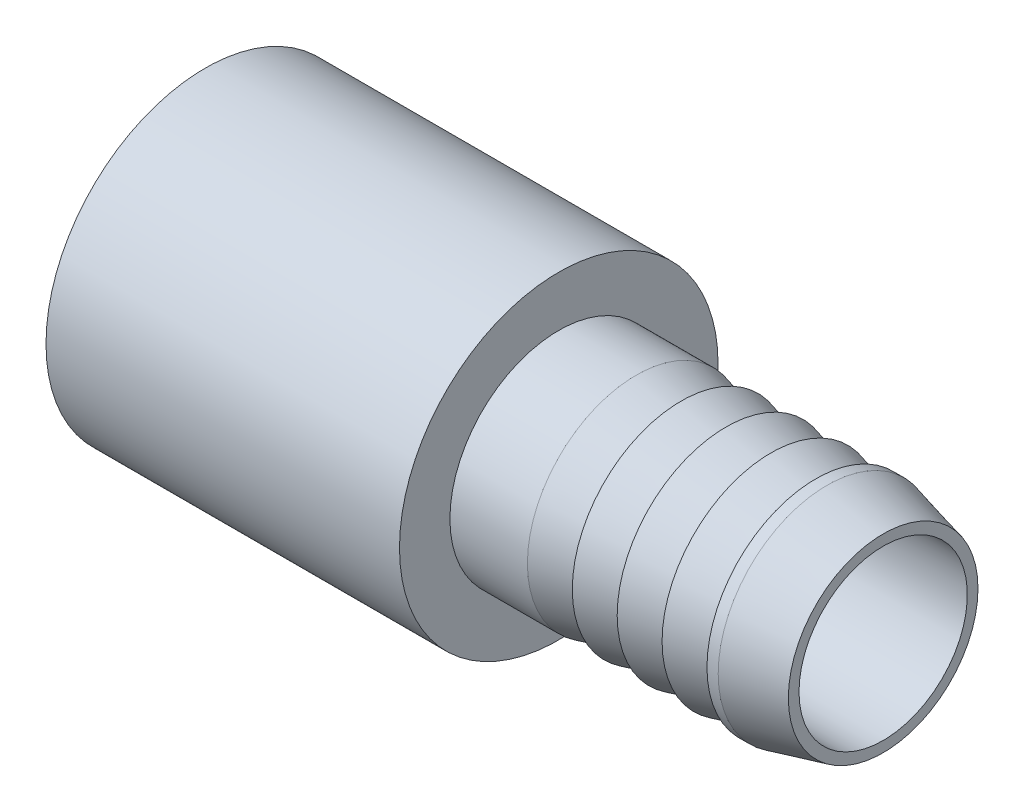
ISO-10303-21;
HEADER;
FILE_DESCRIPTION(('STEP AP214'),'2;1');
FILE_NAME('part.step','',(''),(''),'','','');
FILE_SCHEMA(('AUTOMOTIVE_DESIGN { 1 0 10303 214 1 1 1 1 }'));
ENDSEC;
DATA;
#1=APPLICATION_CONTEXT('core data for automotive mechanical design processes');
#2=APPLICATION_PROTOCOL_DEFINITION('international standard','automotive_design',2000,#1);
#3=PRODUCT_CONTEXT('',#1,'mechanical');
#4=PRODUCT('Part','Part','',(#3));
#5=PRODUCT_RELATED_PRODUCT_CATEGORY('part','',(#4));
#6=PRODUCT_DEFINITION_FORMATION('','',#4);
#7=PRODUCT_DEFINITION_CONTEXT('part definition',#1,'design');
#8=PRODUCT_DEFINITION('design','',#6,#7);
#9=PRODUCT_DEFINITION_SHAPE('','',#8);
#10=(LENGTH_UNIT() NAMED_UNIT(*) SI_UNIT(.MILLI.,.METRE.));
#11=(NAMED_UNIT(*) PLANE_ANGLE_UNIT() SI_UNIT($,.RADIAN.));
#12=(NAMED_UNIT(*) SI_UNIT($,.STERADIAN.) SOLID_ANGLE_UNIT());
#13=UNCERTAINTY_MEASURE_WITH_UNIT(LENGTH_MEASURE(1.E-05),#10,'distance_accuracy_value','');
#14=(GEOMETRIC_REPRESENTATION_CONTEXT(3) GLOBAL_UNCERTAINTY_ASSIGNED_CONTEXT((#13)) GLOBAL_UNIT_ASSIGNED_CONTEXT((#10,
#11,#12)) REPRESENTATION_CONTEXT('',''));
#15=CARTESIAN_POINT('',(0.,0.,0.));
#16=DIRECTION('',(0.,0.,1.));
#17=DIRECTION('',(1.,0.,0.));
#18=AXIS2_PLACEMENT_3D('',#15,#16,#17);
#19=CARTESIAN_POINT('',(-19.304,9.33,0.));
#20=DIRECTION('',(1.,0.,0.));
#21=DIRECTION('',(0.,0.,-1.));
#22=AXIS2_PLACEMENT_3D('',#19,#20,#21);
#23=PLANE('',#22);
#24=CARTESIAN_POINT('',(-19.304,0.3175,0.));
#25=DIRECTION('',(-1.,0.,0.));
#26=DIRECTION('',(0.,0.,1.));
#27=AXIS2_PLACEMENT_3D('',#24,#25,#26);
#28=CIRCLE('',#27,4.7625);
#29=CARTESIAN_POINT('',(-19.304,0.3175,4.7625));
#30=VERTEX_POINT('',#29);
#31=EDGE_CURVE('E56',#30,#30,#28,.T.);
#32=ORIENTED_EDGE('',*,*,#31,.F.);
#33=EDGE_LOOP('',(#32));
#34=FACE_BOUND('',#33,.T.);
#35=CARTESIAN_POINT('',(-19.304,0.3175,0.));
#36=DIRECTION('',(-1.,0.,0.));
#37=DIRECTION('',(0.,0.,1.));
#38=AXIS2_PLACEMENT_3D('',#35,#36,#37);
#39=CIRCLE('',#38,9.0125);
#40=CARTESIAN_POINT('',(-19.304,0.3175,9.0125));
#41=VERTEX_POINT('',#40);
#42=EDGE_CURVE('E111',#41,#41,#39,.T.);
#43=ORIENTED_EDGE('',*,*,#42,.T.);
#44=EDGE_LOOP('',(#43));
#45=FACE_BOUND('',#44,.T.);
#46=ADVANCED_FACE('F43',(#34,#45),#23,.F.);
#47=CARTESIAN_POINT('',(0.,0.3175,0.));
#48=DIRECTION('',(-1.,0.,0.));
#49=DIRECTION('',(0.,0.,1.));
#50=AXIS2_PLACEMENT_3D('',#47,#48,#49);
#51=CYLINDRICAL_SURFACE('',#50,4.7625);
#52=CARTESIAN_POINT('',(19.05,0.3175,0.));
#53=DIRECTION('',(-1.,0.,0.));
#54=DIRECTION('',(0.,0.,1.));
#55=AXIS2_PLACEMENT_3D('',#52,#53,#54);
#56=CIRCLE('',#55,4.7625);
#57=CARTESIAN_POINT('',(19.05,0.3175,4.7625));
#58=VERTEX_POINT('',#57);
#59=EDGE_CURVE('E61',#58,#58,#56,.T.);
#60=ORIENTED_EDGE('',*,*,#59,.F.);
#61=EDGE_LOOP('',(#60));
#62=FACE_BOUND('',#61,.T.);
#63=ORIENTED_EDGE('',*,*,#31,.T.);
#64=EDGE_LOOP('',(#63));
#65=FACE_BOUND('',#64,.T.);
#66=ADVANCED_FACE('F191',(#62,#65),#51,.F.);
#67=CARTESIAN_POINT('',(19.05,5.08,0.));
#68=DIRECTION('',(-1.,0.,0.));
#69=DIRECTION('',(0.,0.,1.));
#70=AXIS2_PLACEMENT_3D('',#67,#68,#69);
#71=PLANE('',#70);
#72=CARTESIAN_POINT('',(19.05,0.3175,0.));
#73=DIRECTION('',(-1.,0.,0.));
#74=DIRECTION('',(0.,0.,1.));
#75=AXIS2_PLACEMENT_3D('',#72,#73,#74);
#76=CIRCLE('',#75,5.36575);
#77=CARTESIAN_POINT('',(19.05,0.3175,5.36574999999999));
#78=VERTEX_POINT('',#77);
#79=EDGE_CURVE('E10',#78,#78,#76,.F.);
#80=ORIENTED_EDGE('',*,*,#79,.T.);
#81=EDGE_LOOP('',(#80));
#82=FACE_BOUND('',#81,.T.);
#83=ORIENTED_EDGE('',*,*,#59,.T.);
#84=EDGE_LOOP('',(#83));
#85=FACE_BOUND('',#84,.T.);
#86=ADVANCED_FACE('F185',(#82,#85),#71,.F.);
#87=CARTESIAN_POINT('',(0.,0.3175,0.));
#88=DIRECTION('',(-1.,0.,0.));
#89=DIRECTION('',(0.,0.,1.));
#90=AXIS2_PLACEMENT_3D('',#87,#88,#89);
#91=CYLINDRICAL_SURFACE('',#90,6.1595);
#92=CARTESIAN_POINT('',(15.8749999999999,0.3175,0.));
#93=DIRECTION('',(-1.,0.,0.));
#94=DIRECTION('',(0.,0.,1.));
#95=AXIS2_PLACEMENT_3D('',#92,#93,#94);
#96=CIRCLE('',#95,6.1595);
#97=CARTESIAN_POINT('',(15.8749999999999,0.3175,6.1595));
#98=VERTEX_POINT('',#97);
#99=EDGE_CURVE('E51',#98,#98,#96,.T.);
#100=ORIENTED_EDGE('',*,*,#99,.T.);
#101=EDGE_LOOP('',(#100));
#102=FACE_BOUND('',#101,.T.);
#103=CARTESIAN_POINT('',(15.24,0.3175,0.));
#104=DIRECTION('',(-1.,0.,0.));
#105=DIRECTION('',(0.,0.,1.));
#106=AXIS2_PLACEMENT_3D('',#103,#104,#105);
#107=CIRCLE('',#106,6.1595);
#108=CARTESIAN_POINT('',(15.24,0.3175,6.1595));
#109=VERTEX_POINT('',#108);
#110=EDGE_CURVE('E67',#109,#109,#107,.T.);
#111=ORIENTED_EDGE('',*,*,#110,.F.);
#112=EDGE_LOOP('',(#111));
#113=FACE_BOUND('',#112,.T.);
#114=ADVANCED_FACE('F180',(#102,#113),#91,.T.);
#115=CARTESIAN_POINT('',(15.24,6.477,0.));
#116=DIRECTION('',(1.,0.,0.));
#117=DIRECTION('',(0.,0.,-1.));
#118=AXIS2_PLACEMENT_3D('',#115,#116,#117);
#119=PLANE('',#118);
#120=CARTESIAN_POINT('',(15.24,0.3175,0.));
#121=DIRECTION('',(-1.,0.,0.));
#122=DIRECTION('',(0.,0.,1.));
#123=AXIS2_PLACEMENT_3D('',#120,#121,#122);
#124=CIRCLE('',#123,5.5245);
#125=CARTESIAN_POINT('',(15.24,0.3175,5.5245));
#126=VERTEX_POINT('',#125);
#127=EDGE_CURVE('E71',#126,#126,#124,.T.);
#128=ORIENTED_EDGE('',*,*,#127,.F.);
#129=EDGE_LOOP('',(#128));
#130=FACE_BOUND('',#129,.T.);
#131=ORIENTED_EDGE('',*,*,#110,.T.);
#132=EDGE_LOOP('',(#131));
#133=FACE_BOUND('',#132,.T.);
#134=ADVANCED_FACE('F174',(#130,#133),#119,.F.);
#135=CARTESIAN_POINT('',(15.24,0.3175,0.));
#136=DIRECTION('',(-1.,0.,0.));
#137=DIRECTION('',(0.,0.,1.));
#138=AXIS2_PLACEMENT_3D('',#135,#136,#137);
#139=CONICAL_SURFACE('',#138,5.5245,0.244978663126864);
#140=CARTESIAN_POINT('',(12.7,0.3175,0.));
#141=DIRECTION('',(-1.,0.,0.));
#142=DIRECTION('',(0.,0.,1.));
#143=AXIS2_PLACEMENT_3D('',#140,#141,#142);
#144=CIRCLE('',#143,6.1595);
#145=CARTESIAN_POINT('',(12.7,0.3175,6.1595));
#146=VERTEX_POINT('',#145);
#147=EDGE_CURVE('E75',#146,#146,#144,.T.);
#148=ORIENTED_EDGE('',*,*,#147,.F.);
#149=EDGE_LOOP('',(#148));
#150=FACE_BOUND('',#149,.T.);
#151=ORIENTED_EDGE('',*,*,#127,.T.);
#152=EDGE_LOOP('',(#151));
#153=FACE_BOUND('',#152,.T.);
#154=ADVANCED_FACE('F168',(#150,#153),#139,.T.);
#155=CARTESIAN_POINT('',(12.7,6.477,0.));
#156=DIRECTION('',(1.,0.,0.));
#157=DIRECTION('',(0.,0.,-1.));
#158=AXIS2_PLACEMENT_3D('',#155,#156,#157);
#159=PLANE('',#158);
#160=CARTESIAN_POINT('',(12.7,0.3175,0.));
#161=DIRECTION('',(-1.,0.,0.));
#162=DIRECTION('',(0.,0.,1.));
#163=AXIS2_PLACEMENT_3D('',#160,#161,#162);
#164=CIRCLE('',#163,5.5245);
#165=CARTESIAN_POINT('',(12.7,0.3175,5.5245));
#166=VERTEX_POINT('',#165);
#167=EDGE_CURVE('E79',#166,#166,#164,.T.);
#168=ORIENTED_EDGE('',*,*,#167,.F.);
#169=EDGE_LOOP('',(#168));
#170=FACE_BOUND('',#169,.T.);
#171=ORIENTED_EDGE('',*,*,#147,.T.);
#172=EDGE_LOOP('',(#171));
#173=FACE_BOUND('',#172,.T.);
#174=ADVANCED_FACE('F162',(#170,#173),#159,.F.);
#175=CARTESIAN_POINT('',(12.7,0.3175,0.));
#176=DIRECTION('',(-1.,0.,0.));
#177=DIRECTION('',(0.,0.,1.));
#178=AXIS2_PLACEMENT_3D('',#175,#176,#177);
#179=CONICAL_SURFACE('',#178,5.5245,0.244978663126864);
#180=CARTESIAN_POINT('',(10.16,0.3175,0.));
#181=DIRECTION('',(-1.,0.,0.));
#182=DIRECTION('',(0.,0.,1.));
#183=AXIS2_PLACEMENT_3D('',#180,#181,#182);
#184=CIRCLE('',#183,6.1595);
#185=CARTESIAN_POINT('',(10.16,0.3175,6.1595));
#186=VERTEX_POINT('',#185);
#187=EDGE_CURVE('E83',#186,#186,#184,.T.);
#188=ORIENTED_EDGE('',*,*,#187,.F.);
#189=EDGE_LOOP('',(#188));
#190=FACE_BOUND('',#189,.T.);
#191=ORIENTED_EDGE('',*,*,#167,.T.);
#192=EDGE_LOOP('',(#191));
#193=FACE_BOUND('',#192,.T.);
#194=ADVANCED_FACE('F156',(#190,#193),#179,.T.);
#195=CARTESIAN_POINT('',(10.16,6.477,0.));
#196=DIRECTION('',(1.,0.,0.));
#197=DIRECTION('',(0.,0.,-1.));
#198=AXIS2_PLACEMENT_3D('',#195,#196,#197);
#199=PLANE('',#198);
#200=CARTESIAN_POINT('',(10.16,0.3175,0.));
#201=DIRECTION('',(-1.,0.,0.));
#202=DIRECTION('',(0.,0.,1.));
#203=AXIS2_PLACEMENT_3D('',#200,#201,#202);
#204=CIRCLE('',#203,5.5245);
#205=CARTESIAN_POINT('',(10.16,0.3175,5.5245));
#206=VERTEX_POINT('',#205);
#207=EDGE_CURVE('E87',#206,#206,#204,.T.);
#208=ORIENTED_EDGE('',*,*,#207,.F.);
#209=EDGE_LOOP('',(#208));
#210=FACE_BOUND('',#209,.T.);
#211=ORIENTED_EDGE('',*,*,#187,.T.);
#212=EDGE_LOOP('',(#211));
#213=FACE_BOUND('',#212,.T.);
#214=ADVANCED_FACE('F150',(#210,#213),#199,.F.);
#215=CARTESIAN_POINT('',(10.16,0.3175,0.));
#216=DIRECTION('',(-1.,0.,0.));
#217=DIRECTION('',(0.,0.,1.));
#218=AXIS2_PLACEMENT_3D('',#215,#216,#217);
#219=CONICAL_SURFACE('',#218,5.5245,0.244978663126864);
#220=CARTESIAN_POINT('',(7.62,0.3175,0.));
#221=DIRECTION('',(-1.,0.,0.));
#222=DIRECTION('',(0.,0.,1.));
#223=AXIS2_PLACEMENT_3D('',#220,#221,#222);
#224=CIRCLE('',#223,6.1595);
#225=CARTESIAN_POINT('',(7.62,0.3175,6.1595));
#226=VERTEX_POINT('',#225);
#227=EDGE_CURVE('E91',#226,#226,#224,.T.);
#228=ORIENTED_EDGE('',*,*,#227,.F.);
#229=EDGE_LOOP('',(#228));
#230=FACE_BOUND('',#229,.T.);
#231=ORIENTED_EDGE('',*,*,#207,.T.);
#232=EDGE_LOOP('',(#231));
#233=FACE_BOUND('',#232,.T.);
#234=ADVANCED_FACE('F144',(#230,#233),#219,.T.);
#235=CARTESIAN_POINT('',(7.62,6.477,0.));
#236=DIRECTION('',(1.,0.,0.));
#237=DIRECTION('',(0.,0.,-1.));
#238=AXIS2_PLACEMENT_3D('',#235,#236,#237);
#239=PLANE('',#238);
#240=CARTESIAN_POINT('',(7.62,0.3175,0.));
#241=DIRECTION('',(-1.,0.,0.));
#242=DIRECTION('',(0.,0.,1.));
#243=AXIS2_PLACEMENT_3D('',#240,#241,#242);
#244=CIRCLE('',#243,5.5245);
#245=CARTESIAN_POINT('',(7.62,0.3175,5.5245));
#246=VERTEX_POINT('',#245);
#247=EDGE_CURVE('E95',#246,#246,#244,.T.);
#248=ORIENTED_EDGE('',*,*,#247,.F.);
#249=EDGE_LOOP('',(#248));
#250=FACE_BOUND('',#249,.T.);
#251=ORIENTED_EDGE('',*,*,#227,.T.);
#252=EDGE_LOOP('',(#251));
#253=FACE_BOUND('',#252,.T.);
#254=ADVANCED_FACE('F138',(#250,#253),#239,.F.);
#255=CARTESIAN_POINT('',(7.62,0.3175,0.));
#256=DIRECTION('',(-1.,0.,0.));
#257=DIRECTION('',(0.,0.,1.));
#258=AXIS2_PLACEMENT_3D('',#255,#256,#257);
#259=CONICAL_SURFACE('',#258,5.5245,0.244978663126864);
#260=CARTESIAN_POINT('',(5.08,0.3175,0.));
#261=DIRECTION('',(-1.,0.,0.));
#262=DIRECTION('',(0.,0.,1.));
#263=AXIS2_PLACEMENT_3D('',#260,#261,#262);
#264=CIRCLE('',#263,6.1595);
#265=CARTESIAN_POINT('',(5.08,0.3175,6.1595));
#266=VERTEX_POINT('',#265);
#267=EDGE_CURVE('E99',#266,#266,#264,.T.);
#268=ORIENTED_EDGE('',*,*,#267,.F.);
#269=EDGE_LOOP('',(#268));
#270=FACE_BOUND('',#269,.T.);
#271=ORIENTED_EDGE('',*,*,#247,.T.);
#272=EDGE_LOOP('',(#271));
#273=FACE_BOUND('',#272,.T.);
#274=ADVANCED_FACE('F132',(#270,#273),#259,.T.);
#275=CARTESIAN_POINT('',(0.,0.3175,0.));
#276=DIRECTION('',(-1.,0.,0.));
#277=DIRECTION('',(0.,0.,1.));
#278=AXIS2_PLACEMENT_3D('',#275,#276,#277);
#279=CYLINDRICAL_SURFACE('',#278,6.1595);
#280=CARTESIAN_POINT('',(0.695999999999999,0.3175,0.));
#281=DIRECTION('',(-1.,0.,0.));
#282=DIRECTION('',(0.,0.,1.));
#283=AXIS2_PLACEMENT_3D('',#280,#281,#282);
#284=CIRCLE('',#283,6.1595);
#285=CARTESIAN_POINT('',(0.695999999999999,0.3175,6.1595));
#286=VERTEX_POINT('',#285);
#287=EDGE_CURVE('E103',#286,#286,#284,.T.);
#288=ORIENTED_EDGE('',*,*,#287,.F.);
#289=EDGE_LOOP('',(#288));
#290=FACE_BOUND('',#289,.T.);
#291=ORIENTED_EDGE('',*,*,#267,.T.);
#292=EDGE_LOOP('',(#291));
#293=FACE_BOUND('',#292,.T.);
#294=ADVANCED_FACE('F126',(#290,#293),#279,.T.);
#295=CARTESIAN_POINT('',(0.695999999999999,6.477,0.));
#296=DIRECTION('',(-1.,0.,0.));
#297=DIRECTION('',(0.,0.,1.));
#298=AXIS2_PLACEMENT_3D('',#295,#296,#297);
#299=PLANE('',#298);
#300=CARTESIAN_POINT('',(0.695999999999999,0.3175,0.));
#301=DIRECTION('',(-1.,0.,0.));
#302=DIRECTION('',(0.,0.,1.));
#303=AXIS2_PLACEMENT_3D('',#300,#301,#302);
#304=CIRCLE('',#303,9.0125);
#305=CARTESIAN_POINT('',(0.695999999999999,0.3175,9.0125));
#306=VERTEX_POINT('',#305);
#307=EDGE_CURVE('E107',#306,#306,#304,.T.);
#308=ORIENTED_EDGE('',*,*,#307,.F.);
#309=EDGE_LOOP('',(#308));
#310=FACE_BOUND('',#309,.T.);
#311=ORIENTED_EDGE('',*,*,#287,.T.);
#312=EDGE_LOOP('',(#311));
#313=FACE_BOUND('',#312,.T.);
#314=ADVANCED_FACE('F120',(#310,#313),#299,.F.);
#315=CARTESIAN_POINT('',(0.,0.3175,0.));
#316=DIRECTION('',(-1.,0.,0.));
#317=DIRECTION('',(0.,0.,1.));
#318=AXIS2_PLACEMENT_3D('',#315,#316,#317);
#319=CYLINDRICAL_SURFACE('',#318,9.0125);
#320=ORIENTED_EDGE('',*,*,#42,.F.);
#321=EDGE_LOOP('',(#320));
#322=FACE_BOUND('',#321,.T.);
#323=ORIENTED_EDGE('',*,*,#307,.T.);
#324=EDGE_LOOP('',(#323));
#325=FACE_BOUND('',#324,.T.);
#326=ADVANCED_FACE('F117',(#322,#325),#319,.T.);
#327=CARTESIAN_POINT('',(15.8749999999999,0.3175,0.));
#328=DIRECTION('',(-1.,0.,0.));
#329=DIRECTION('',(0.,0.,1.));
#330=AXIS2_PLACEMENT_3D('',#327,#328,#329);
#331=CONICAL_SURFACE('',#330,6.1595,0.244978663126861);
#332=CARTESIAN_POINT('',(19.05,0.3175,5.36574999999999));
#333=CARTESIAN_POINT('',(19.0169270833333,0.3175,5.37401822916666));
#334=CARTESIAN_POINT('',(18.9838541666667,0.3175,5.38228645833333));
#335=CARTESIAN_POINT('',(18.9177083333333,0.3175,5.39882291666666));
#336=CARTESIAN_POINT('',(18.8846354166667,0.3175,5.40709114583333));
#337=CARTESIAN_POINT('',(18.8184895833333,0.3175,5.42362760416666));
#338=CARTESIAN_POINT('',(18.7854166666667,0.3175,5.43189583333333));
#339=CARTESIAN_POINT('',(18.7192708333333,0.3175,5.44843229166666));
#340=CARTESIAN_POINT('',(18.6861979166667,0.3175,5.45670052083333));
#341=CARTESIAN_POINT('',(18.6200520833333,0.3175,5.47323697916666));
#342=CARTESIAN_POINT('',(18.5869791666667,0.3175,5.48150520833333));
#343=CARTESIAN_POINT('',(18.5208333333333,0.3175,5.49804166666666));
#344=CARTESIAN_POINT('',(18.4877604166667,0.3175,5.50630989583333));
#345=CARTESIAN_POINT('',(18.4216145833333,0.3175,5.52284635416666));
#346=CARTESIAN_POINT('',(18.3885416666667,0.3175,5.53111458333333));
#347=CARTESIAN_POINT('',(18.3223958333333,0.3175,5.54765104166666));
#348=CARTESIAN_POINT('',(18.2893229166666,0.3175,5.55591927083333));
#349=CARTESIAN_POINT('',(18.2231770833333,0.3175,5.57245572916666));
#350=CARTESIAN_POINT('',(18.1901041666666,0.3175,5.58072395833333));
#351=CARTESIAN_POINT('',(18.1239583333333,0.3175,5.59726041666666));
#352=CARTESIAN_POINT('',(18.0908854166666,0.3175,5.60552864583333));
#353=CARTESIAN_POINT('',(18.0247395833333,0.3175,5.62206510416666));
#354=CARTESIAN_POINT('',(17.9916666666666,0.3175,5.63033333333333));
#355=CARTESIAN_POINT('',(17.9255208333333,0.3175,5.64686979166666));
#356=CARTESIAN_POINT('',(17.8924479166666,0.3175,5.65513802083333));
#357=CARTESIAN_POINT('',(17.8263020833333,0.3175,5.67167447916666));
#358=CARTESIAN_POINT('',(17.7932291666666,0.3175,5.67994270833333));
#359=CARTESIAN_POINT('',(17.7270833333333,0.3175,5.69647916666666));
#360=CARTESIAN_POINT('',(17.6940104166666,0.3175,5.70474739583333));
#361=CARTESIAN_POINT('',(17.6278645833333,0.3175,5.72128385416666));
#362=CARTESIAN_POINT('',(17.5947916666666,0.3175,5.72955208333333));
#363=CARTESIAN_POINT('',(17.5286458333333,0.3175,5.74608854166667));
#364=CARTESIAN_POINT('',(17.4955729166666,0.3175,5.75435677083333));
#365=CARTESIAN_POINT('',(17.4294270833333,0.3175,5.77089322916667));
#366=CARTESIAN_POINT('',(17.3963541666666,0.3175,5.77916145833333));
#367=CARTESIAN_POINT('',(17.3302083333333,0.3175,5.79569791666666));
#368=CARTESIAN_POINT('',(17.2971354166666,0.3175,5.80396614583333));
#369=CARTESIAN_POINT('',(17.2309895833333,0.3175,5.82050260416667));
#370=CARTESIAN_POINT('',(17.1979166666666,0.3175,5.82877083333333));
#371=CARTESIAN_POINT('',(17.1317708333333,0.3175,5.84530729166667));
#372=CARTESIAN_POINT('',(17.0986979166666,0.3175,5.85357552083333));
#373=CARTESIAN_POINT('',(17.0325520833333,0.3175,5.87011197916667));
#374=CARTESIAN_POINT('',(16.9994791666666,0.3175,5.87838020833333));
#375=CARTESIAN_POINT('',(16.9333333333333,0.3175,5.89491666666667));
#376=CARTESIAN_POINT('',(16.9002604166666,0.3175,5.90318489583333));
#377=CARTESIAN_POINT('',(16.8341145833333,0.3175,5.91972135416667));
#378=CARTESIAN_POINT('',(16.8010416666666,0.3175,5.92798958333333));
#379=CARTESIAN_POINT('',(16.7348958333333,0.3175,5.94452604166667));
#380=CARTESIAN_POINT('',(16.7018229166666,0.3175,5.95279427083333));
#381=CARTESIAN_POINT('',(16.6356770833333,0.3175,5.96933072916667));
#382=CARTESIAN_POINT('',(16.6026041666666,0.3175,5.97759895833333));
#383=CARTESIAN_POINT('',(16.5364583333333,0.3175,5.99413541666667));
#384=CARTESIAN_POINT('',(16.5033854166666,0.3175,6.00240364583333));
#385=CARTESIAN_POINT('',(16.4372395833333,0.3175,6.01894010416667));
#386=CARTESIAN_POINT('',(16.4041666666666,0.3175,6.02720833333333));
#387=CARTESIAN_POINT('',(16.3380208333333,0.3175,6.04374479166667));
#388=CARTESIAN_POINT('',(16.3049479166666,0.3175,6.05201302083334));
#389=CARTESIAN_POINT('',(16.2388020833333,0.3175,6.06854947916667));
#390=CARTESIAN_POINT('',(16.2057291666666,0.3175,6.07681770833333));
#391=CARTESIAN_POINT('',(16.1395833333333,0.3175,6.09335416666667));
#392=CARTESIAN_POINT('',(16.1065104166666,0.3175,6.10162239583333));
#393=CARTESIAN_POINT('',(16.0403645833333,0.3175,6.11815885416667));
#394=CARTESIAN_POINT('',(16.0072916666666,0.3175,6.12642708333334));
#395=CARTESIAN_POINT('',(15.9411458333333,0.3175,6.14296354166667));
#396=CARTESIAN_POINT('',(15.9080729166666,0.3175,6.15123177083334));
#397=CARTESIAN_POINT('',(15.8749999999999,0.3175,6.1595));
#398=B_SPLINE_CURVE_WITH_KNOTS('',3,(#332,#333,#334,#335,#336,#337,#338,#339,#340,#341,#342,
#343,#344,#345,#346,#347,#348,#349,#350,#351,#352,#353,#354,#355,#356,#357,#358,#359,#360,#361,
#362,#363,#364,#365,#366,#367,#368,#369,#370,#371,#372,#373,#374,#375,#376,#377,#378,#379,#380,
#381,#382,#383,#384,#385,#386,#387,#388,#389,#390,#391,#392,#393,#394,#395,#396,#397),
.UNSPECIFIED.,.F.,.F.,(4,2,2,2,2,2,2,2,2,2,2,2,2,2,2,2,2,2,2,2,2,2,2,2,2,2,2,2,2,2,2,2,4),(0.,
0.102272346572943,0.204544693145882,0.306817039718821,0.409089386291764,0.511361732864703,
0.613634079437643,0.715906426010585,0.818178772583525,0.920451119156464,1.02272346572941,
1.12499581230235,1.22726815887528,1.32954050544822,1.43181285202117,1.53408519859411,
1.63635754516705,1.73862989173999,1.84090223831293,1.94317458488587,2.04544693145881,
2.14771927803175,2.24999162460469,2.35226397117763,2.45453631775057,2.55680866432351,
2.65908101089645,2.76135335746939,2.86362570404233,2.96589805061527,3.06817039718821,
3.17044274376115,3.27271509033409),.UNSPECIFIED.);
#399=EDGE_CURVE('BSEAM45',#78,#98,#398,.T.);
#400=ORIENTED_EDGE('',*,*,#79,.F.);
#401=ORIENTED_EDGE('',*,*,#99,.F.);
#402=ORIENTED_EDGE('',*,*,#399,.T.);
#403=ORIENTED_EDGE('',*,*,#399,.F.);
#404=EDGE_LOOP('',(#400,#402,#401,#403));
#405=FACE_BOUND('',#404,.T.);
#406=ADVANCED_FACE('F45',(#405),#331,.T.);
#407=CLOSED_SHELL('',(#46,#66,#86,#114,#134,#154,#174,#194,#214,#234,#254,#274,#294,#314,#326,#406));
#408=MANIFOLD_SOLID_BREP('B2',#407);
#409=ADVANCED_BREP_SHAPE_REPRESENTATION('',(#18,#408),#14);
#410=SHAPE_DEFINITION_REPRESENTATION(#9,#409);
ENDSEC;
END-ISO-10303-21;
